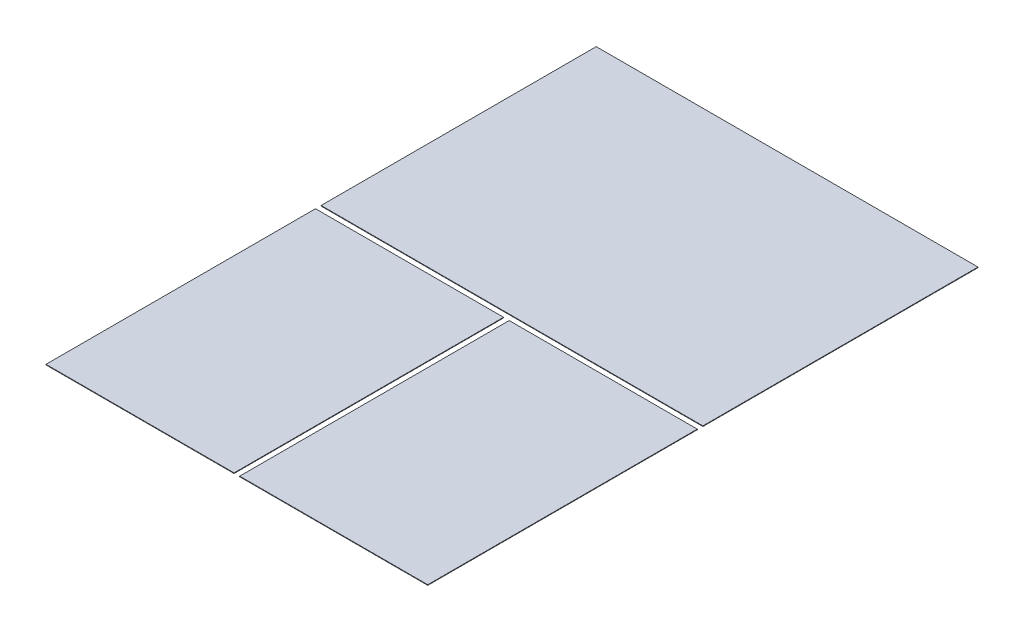
ISO-10303-21;
HEADER;
FILE_DESCRIPTION(('STEP AP214'),'2;1');
FILE_NAME('part.step','',(''),(''),'','','');
FILE_SCHEMA(('AUTOMOTIVE_DESIGN { 1 0 10303 214 1 1 1 1 }'));
ENDSEC;
DATA;
#1=APPLICATION_CONTEXT('core data for automotive mechanical design processes');
#2=APPLICATION_PROTOCOL_DEFINITION('international standard','automotive_design',2000,#1);
#3=PRODUCT_CONTEXT('',#1,'mechanical');
#4=PRODUCT('Part','Part','',(#3));
#5=PRODUCT_RELATED_PRODUCT_CATEGORY('part','',(#4));
#6=PRODUCT_DEFINITION_FORMATION('','',#4);
#7=PRODUCT_DEFINITION_CONTEXT('part definition',#1,'design');
#8=PRODUCT_DEFINITION('design','',#6,#7);
#9=PRODUCT_DEFINITION_SHAPE('','',#8);
#10=(LENGTH_UNIT() NAMED_UNIT(*) SI_UNIT(.MILLI.,.METRE.));
#11=(NAMED_UNIT(*) PLANE_ANGLE_UNIT() SI_UNIT($,.RADIAN.));
#12=(NAMED_UNIT(*) SI_UNIT($,.STERADIAN.) SOLID_ANGLE_UNIT());
#13=UNCERTAINTY_MEASURE_WITH_UNIT(LENGTH_MEASURE(1.E-05),#10,'distance_accuracy_value','');
#14=(GEOMETRIC_REPRESENTATION_CONTEXT(3) GLOBAL_UNCERTAINTY_ASSIGNED_CONTEXT((#13)) GLOBAL_UNIT_ASSIGNED_CONTEXT((#10,
#11,#12)) REPRESENTATION_CONTEXT('',''));
#15=CARTESIAN_POINT('',(0.,0.,0.));
#16=DIRECTION('',(0.,0.,1.));
#17=DIRECTION('',(1.,0.,0.));
#18=AXIS2_PLACEMENT_3D('',#15,#16,#17);
#19=CARTESIAN_POINT('',(122.303454746925,5.,0.));
#20=DIRECTION('',(1.,0.,0.));
#21=DIRECTION('',(0.,0.,-1.));
#22=AXIS2_PLACEMENT_3D('',#19,#20,#21);
#23=PLANE('',#22);
#24=DIRECTION('',(0.,0.,1.));
#25=VECTOR('',#24,1.);
#26=CARTESIAN_POINT('',(122.303454746925,0.,0.));
#27=LINE('',#26,#25);
#28=CARTESIAN_POINT('',(122.303454746925,0.,24.7790305469408));
#29=VERTEX_POINT('',#28);
#30=CARTESIAN_POINT('',(122.303454746925,0.,2424.77903054694));
#31=VERTEX_POINT('',#30);
#32=EDGE_CURVE('E109',#29,#31,#27,.T.);
#33=ORIENTED_EDGE('',*,*,#32,.F.);
#34=DIRECTION('',(0.,-1.,0.));
#35=VECTOR('',#34,1.);
#36=CARTESIAN_POINT('',(122.303454746925,5.,24.7790305469408));
#37=LINE('',#36,#35);
#38=CARTESIAN_POINT('',(122.303454746925,5.,24.7790305469408));
#39=VERTEX_POINT('',#38);
#40=EDGE_CURVE('E12',#39,#29,#37,.T.);
#41=ORIENTED_EDGE('',*,*,#40,.F.);
#42=DIRECTION('',(0.,0.,1.));
#43=VECTOR('',#42,1.);
#44=CARTESIAN_POINT('',(122.303454746925,5.,0.));
#45=LINE('',#44,#43);
#46=CARTESIAN_POINT('',(122.303454746925,5.,2424.77903054694));
#47=VERTEX_POINT('',#46);
#48=EDGE_CURVE('E103',#39,#47,#45,.T.);
#49=ORIENTED_EDGE('',*,*,#48,.T.);
#50=DIRECTION('',(0.,-1.,0.));
#51=VECTOR('',#50,1.);
#52=CARTESIAN_POINT('',(122.303454746925,5.,2424.77903054694));
#53=LINE('',#52,#51);
#54=EDGE_CURVE('E84',#47,#31,#53,.T.);
#55=ORIENTED_EDGE('',*,*,#54,.T.);
#56=EDGE_LOOP('',(#33,#41,#49,#55));
#57=FACE_BOUND('',#56,.T.);
#58=ADVANCED_FACE('F46',(#57),#23,.T.);
#59=CARTESIAN_POINT('',(0.,5.,24.7790305469408));
#60=DIRECTION('',(0.,0.,-1.));
#61=DIRECTION('',(-1.,0.,0.));
#62=AXIS2_PLACEMENT_3D('',#59,#60,#61);
#63=PLANE('',#62);
#64=DIRECTION('',(1.,0.,0.));
#65=VECTOR('',#64,1.);
#66=CARTESIAN_POINT('',(0.,0.,24.7790305469408));
#67=LINE('',#66,#65);
#68=CARTESIAN_POINT('',(-1552.69654525308,0.,24.7790305469408));
#69=VERTEX_POINT('',#68);
#70=EDGE_CURVE('E97',#69,#29,#67,.T.);
#71=ORIENTED_EDGE('',*,*,#70,.F.);
#72=DIRECTION('',(0.,-1.,0.));
#73=VECTOR('',#72,1.);
#74=CARTESIAN_POINT('',(-1552.69654525308,5.,24.7790305469408));
#75=LINE('',#74,#73);
#76=CARTESIAN_POINT('',(-1552.69654525308,5.,24.7790305469408));
#77=VERTEX_POINT('',#76);
#78=EDGE_CURVE('E54',#77,#69,#75,.T.);
#79=ORIENTED_EDGE('',*,*,#78,.F.);
#80=DIRECTION('',(1.,0.,0.));
#81=VECTOR('',#80,1.);
#82=CARTESIAN_POINT('',(0.,5.,24.7790305469408));
#83=LINE('',#82,#81);
#84=EDGE_CURVE('E95',#77,#39,#83,.T.);
#85=ORIENTED_EDGE('',*,*,#84,.T.);
#86=ORIENTED_EDGE('',*,*,#40,.T.);
#87=EDGE_LOOP('',(#71,#79,#85,#86));
#88=FACE_BOUND('',#87,.T.);
#89=ADVANCED_FACE('F93',(#88),#63,.T.);
#90=CARTESIAN_POINT('',(-1552.69654525308,5.,0.));
#91=DIRECTION('',(1.,0.,0.));
#92=DIRECTION('',(0.,0.,-1.));
#93=AXIS2_PLACEMENT_3D('',#90,#91,#92);
#94=PLANE('',#93);
#95=DIRECTION('',(0.,0.,1.));
#96=VECTOR('',#95,1.);
#97=CARTESIAN_POINT('',(-1552.69654525308,0.,0.));
#98=LINE('',#97,#96);
#99=CARTESIAN_POINT('',(-1552.69654525308,0.,2424.77903054694));
#100=VERTEX_POINT('',#99);
#101=EDGE_CURVE('E77',#69,#100,#98,.T.);
#102=ORIENTED_EDGE('',*,*,#101,.T.);
#103=DIRECTION('',(0.,-1.,0.));
#104=VECTOR('',#103,1.);
#105=CARTESIAN_POINT('',(-1552.69654525308,5.,2424.77903054694));
#106=LINE('',#105,#104);
#107=CARTESIAN_POINT('',(-1552.69654525308,5.,2424.77903054694));
#108=VERTEX_POINT('',#107);
#109=EDGE_CURVE('E98',#108,#100,#106,.T.);
#110=ORIENTED_EDGE('',*,*,#109,.F.);
#111=DIRECTION('',(0.,0.,1.));
#112=VECTOR('',#111,1.);
#113=CARTESIAN_POINT('',(-1552.69654525308,5.,0.));
#114=LINE('',#113,#112);
#115=EDGE_CURVE('E99',#77,#108,#114,.T.);
#116=ORIENTED_EDGE('',*,*,#115,.F.);
#117=ORIENTED_EDGE('',*,*,#78,.T.);
#118=EDGE_LOOP('',(#102,#110,#116,#117));
#119=FACE_BOUND('',#118,.T.);
#120=ADVANCED_FACE('F100',(#119),#94,.F.);
#121=CARTESIAN_POINT('',(-6.42876539544234E-13,5.,2424.77903054694));
#122=DIRECTION('',(0.,0.,-1.));
#123=DIRECTION('',(-1.,0.,0.));
#124=AXIS2_PLACEMENT_3D('',#121,#122,#123);
#125=PLANE('',#124);
#126=DIRECTION('',(1.,0.,0.));
#127=VECTOR('',#126,1.);
#128=CARTESIAN_POINT('',(-6.42876539544234E-13,0.,2424.77903054694));
#129=LINE('',#128,#127);
#130=EDGE_CURVE('E105',#100,#31,#129,.T.);
#131=ORIENTED_EDGE('',*,*,#130,.T.);
#132=ORIENTED_EDGE('',*,*,#54,.F.);
#133=DIRECTION('',(1.,0.,0.));
#134=VECTOR('',#133,1.);
#135=CARTESIAN_POINT('',(-6.42876539544234E-13,5.,2424.77903054694));
#136=LINE('',#135,#134);
#137=EDGE_CURVE('E62',#108,#47,#136,.T.);
#138=ORIENTED_EDGE('',*,*,#137,.F.);
#139=ORIENTED_EDGE('',*,*,#109,.T.);
#140=EDGE_LOOP('',(#131,#132,#138,#139));
#141=FACE_BOUND('',#140,.T.);
#142=ADVANCED_FACE('F118',(#141),#125,.F.);
#143=CARTESIAN_POINT('',(0.,5.,0.));
#144=DIRECTION('',(0.,1.,0.));
#145=DIRECTION('',(0.,0.,1.));
#146=AXIS2_PLACEMENT_3D('',#143,#144,#145);
#147=PLANE('',#146);
#148=ORIENTED_EDGE('',*,*,#48,.F.);
#149=ORIENTED_EDGE('',*,*,#84,.F.);
#150=ORIENTED_EDGE('',*,*,#115,.T.);
#151=ORIENTED_EDGE('',*,*,#137,.T.);
#152=EDGE_LOOP('',(#148,#149,#150,#151));
#153=FACE_BOUND('',#152,.T.);
#154=ADVANCED_FACE('F102',(#153),#147,.T.);
#155=CARTESIAN_POINT('',(0.,0.,0.));
#156=DIRECTION('',(0.,1.,0.));
#157=DIRECTION('',(0.,0.,1.));
#158=AXIS2_PLACEMENT_3D('',#155,#156,#157);
#159=PLANE('',#158);
#160=ORIENTED_EDGE('',*,*,#32,.T.);
#161=ORIENTED_EDGE('',*,*,#130,.F.);
#162=ORIENTED_EDGE('',*,*,#101,.F.);
#163=ORIENTED_EDGE('',*,*,#70,.T.);
#164=EDGE_LOOP('',(#160,#161,#162,#163));
#165=FACE_BOUND('',#164,.T.);
#166=ADVANCED_FACE('F120',(#165),#159,.F.);
#167=CLOSED_SHELL('',(#58,#89,#120,#142,#154,#166));
#168=MANIFOLD_SOLID_BREP('B2',#167);
#169=CARTESIAN_POINT('',(0.,5.,24.779030546941));
#170=DIRECTION('',(0.,0.,-1.));
#171=DIRECTION('',(-1.,0.,0.));
#172=AXIS2_PLACEMENT_3D('',#169,#170,#171);
#173=PLANE('',#172);
#174=DIRECTION('',(1.,0.,0.));
#175=VECTOR('',#174,1.);
#176=CARTESIAN_POINT('',(0.,0.,24.779030546941));
#177=LINE('',#176,#175);
#178=CARTESIAN_POINT('',(172.303454746924,0.,24.779030546941));
#179=VERTEX_POINT('',#178);
#180=CARTESIAN_POINT('',(1847.30345474692,0.,24.7790305469408));
#181=VERTEX_POINT('',#180);
#182=EDGE_CURVE('E245',#179,#181,#177,.T.);
#183=ORIENTED_EDGE('',*,*,#182,.F.);
#184=DIRECTION('',(0.,-1.,0.));
#185=VECTOR('',#184,1.);
#186=CARTESIAN_POINT('',(172.303454746924,5.,24.779030546941));
#187=LINE('',#186,#185);
#188=CARTESIAN_POINT('',(172.303454746924,5.,24.779030546941));
#189=VERTEX_POINT('',#188);
#190=EDGE_CURVE('E44',#189,#179,#187,.T.);
#191=ORIENTED_EDGE('',*,*,#190,.F.);
#192=DIRECTION('',(1.,0.,0.));
#193=VECTOR('',#192,1.);
#194=CARTESIAN_POINT('',(0.,5.,24.779030546941));
#195=LINE('',#194,#193);
#196=CARTESIAN_POINT('',(1847.30345474692,5.,24.7790305469408));
#197=VERTEX_POINT('',#196);
#198=EDGE_CURVE('E230',#189,#197,#195,.T.);
#199=ORIENTED_EDGE('',*,*,#198,.T.);
#200=DIRECTION('',(0.,-1.,0.));
#201=VECTOR('',#200,1.);
#202=CARTESIAN_POINT('',(1847.30345474692,5.,24.7790305469408));
#203=LINE('',#202,#201);
#204=EDGE_CURVE('E198',#197,#181,#203,.T.);
#205=ORIENTED_EDGE('',*,*,#204,.T.);
#206=EDGE_LOOP('',(#183,#191,#199,#205));
#207=FACE_BOUND('',#206,.T.);
#208=ADVANCED_FACE('F182',(#207),#173,.T.);
#209=CARTESIAN_POINT('',(172.303454746924,5.,0.));
#210=DIRECTION('',(1.,0.,0.));
#211=DIRECTION('',(0.,0.,-1.));
#212=AXIS2_PLACEMENT_3D('',#209,#210,#211);
#213=PLANE('',#212);
#214=DIRECTION('',(0.,0.,1.));
#215=VECTOR('',#214,1.);
#216=CARTESIAN_POINT('',(172.303454746924,0.,0.));
#217=LINE('',#216,#215);
#218=CARTESIAN_POINT('',(172.303454746925,0.,2424.77903054694));
#219=VERTEX_POINT('',#218);
#220=EDGE_CURVE('E236',#179,#219,#217,.T.);
#221=ORIENTED_EDGE('',*,*,#220,.T.);
#222=DIRECTION('',(0.,-1.,0.));
#223=VECTOR('',#222,1.);
#224=CARTESIAN_POINT('',(172.303454746925,5.,2424.77903054694));
#225=LINE('',#224,#223);
#226=CARTESIAN_POINT('',(172.303454746925,5.,2424.77903054694));
#227=VERTEX_POINT('',#226);
#228=EDGE_CURVE('E190',#227,#219,#225,.T.);
#229=ORIENTED_EDGE('',*,*,#228,.F.);
#230=DIRECTION('',(0.,0.,1.));
#231=VECTOR('',#230,1.);
#232=CARTESIAN_POINT('',(172.303454746924,5.,0.));
#233=LINE('',#232,#231);
#234=EDGE_CURVE('E224',#189,#227,#233,.T.);
#235=ORIENTED_EDGE('',*,*,#234,.F.);
#236=ORIENTED_EDGE('',*,*,#190,.T.);
#237=EDGE_LOOP('',(#221,#229,#235,#236));
#238=FACE_BOUND('',#237,.T.);
#239=ADVANCED_FACE('F234',(#238),#213,.F.);
#240=CARTESIAN_POINT('',(0.,5.,2424.77903054694));
#241=DIRECTION('',(0.,0.,1.));
#242=DIRECTION('',(1.,0.,0.));
#243=AXIS2_PLACEMENT_3D('',#240,#241,#242);
#244=PLANE('',#243);
#245=DIRECTION('',(-1.,0.,0.));
#246=VECTOR('',#245,1.);
#247=CARTESIAN_POINT('',(0.,0.,2424.77903054694));
#248=LINE('',#247,#246);
#249=CARTESIAN_POINT('',(1847.30345474692,0.,2424.77903054694));
#250=VERTEX_POINT('',#249);
#251=EDGE_CURVE('E248',#250,#219,#248,.T.);
#252=ORIENTED_EDGE('',*,*,#251,.F.);
#253=DIRECTION('',(0.,-1.,0.));
#254=VECTOR('',#253,1.);
#255=CARTESIAN_POINT('',(1847.30345474692,5.,2424.77903054694));
#256=LINE('',#255,#254);
#257=CARTESIAN_POINT('',(1847.30345474692,5.,2424.77903054694));
#258=VERTEX_POINT('',#257);
#259=EDGE_CURVE('E211',#258,#250,#256,.T.);
#260=ORIENTED_EDGE('',*,*,#259,.F.);
#261=DIRECTION('',(-1.,0.,0.));
#262=VECTOR('',#261,1.);
#263=CARTESIAN_POINT('',(0.,5.,2424.77903054694));
#264=LINE('',#263,#262);
#265=EDGE_CURVE('E229',#258,#227,#264,.T.);
#266=ORIENTED_EDGE('',*,*,#265,.T.);
#267=ORIENTED_EDGE('',*,*,#228,.T.);
#268=EDGE_LOOP('',(#252,#260,#266,#267));
#269=FACE_BOUND('',#268,.T.);
#270=ADVANCED_FACE('F239',(#269),#244,.T.);
#271=CARTESIAN_POINT('',(1847.30345474692,5.,-3.41819804821605E-13));
#272=DIRECTION('',(1.,0.,0.));
#273=DIRECTION('',(0.,0.,-1.));
#274=AXIS2_PLACEMENT_3D('',#271,#272,#273);
#275=PLANE('',#274);
#276=DIRECTION('',(0.,0.,1.));
#277=VECTOR('',#276,1.);
#278=CARTESIAN_POINT('',(1847.30345474692,0.,-3.41819804821605E-13));
#279=LINE('',#278,#277);
#280=EDGE_CURVE('E250',#181,#250,#279,.T.);
#281=ORIENTED_EDGE('',*,*,#280,.F.);
#282=ORIENTED_EDGE('',*,*,#204,.F.);
#283=DIRECTION('',(0.,0.,1.));
#284=VECTOR('',#283,1.);
#285=CARTESIAN_POINT('',(1847.30345474692,5.,-3.41819804821605E-13));
#286=LINE('',#285,#284);
#287=EDGE_CURVE('E240',#197,#258,#286,.T.);
#288=ORIENTED_EDGE('',*,*,#287,.T.);
#289=ORIENTED_EDGE('',*,*,#259,.T.);
#290=EDGE_LOOP('',(#281,#282,#288,#289));
#291=FACE_BOUND('',#290,.T.);
#292=ADVANCED_FACE('F255',(#291),#275,.T.);
#293=CARTESIAN_POINT('',(0.,5.,0.));
#294=DIRECTION('',(0.,1.,0.));
#295=DIRECTION('',(0.,0.,1.));
#296=AXIS2_PLACEMENT_3D('',#293,#294,#295);
#297=PLANE('',#296);
#298=ORIENTED_EDGE('',*,*,#198,.F.);
#299=ORIENTED_EDGE('',*,*,#234,.T.);
#300=ORIENTED_EDGE('',*,*,#265,.F.);
#301=ORIENTED_EDGE('',*,*,#287,.F.);
#302=EDGE_LOOP('',(#298,#299,#300,#301));
#303=FACE_BOUND('',#302,.T.);
#304=ADVANCED_FACE('F226',(#303),#297,.T.);
#305=CARTESIAN_POINT('',(0.,0.,0.));
#306=DIRECTION('',(0.,1.,0.));
#307=DIRECTION('',(0.,0.,1.));
#308=AXIS2_PLACEMENT_3D('',#305,#306,#307);
#309=PLANE('',#308);
#310=ORIENTED_EDGE('',*,*,#182,.T.);
#311=ORIENTED_EDGE('',*,*,#280,.T.);
#312=ORIENTED_EDGE('',*,*,#251,.T.);
#313=ORIENTED_EDGE('',*,*,#220,.F.);
#314=EDGE_LOOP('',(#310,#311,#312,#313));
#315=FACE_BOUND('',#314,.T.);
#316=ADVANCED_FACE('F262',(#315),#309,.F.);
#317=CLOSED_SHELL('',(#208,#239,#270,#292,#304,#316));
#318=MANIFOLD_SOLID_BREP('B6',#317);
#319=CARTESIAN_POINT('',(-1552.69654525308,5.,0.));
#320=DIRECTION('',(-1.,0.,0.));
#321=DIRECTION('',(0.,0.,1.));
#322=AXIS2_PLACEMENT_3D('',#319,#320,#321);
#323=PLANE('',#322);
#324=DIRECTION('',(0.,0.,-1.));
#325=VECTOR('',#324,1.);
#326=CARTESIAN_POINT('',(-1552.69654525308,0.,0.));
#327=LINE('',#326,#325);
#328=CARTESIAN_POINT('',(-1552.69654525308,0.,-25.2209694530592));
#329=VERTEX_POINT('',#328);
#330=CARTESIAN_POINT('',(-1552.69654525308,0.,-2475.22096945306));
#331=VERTEX_POINT('',#330);
#332=EDGE_CURVE('E372',#329,#331,#327,.T.);
#333=ORIENTED_EDGE('',*,*,#332,.F.);
#334=DIRECTION('',(0.,-1.,0.));
#335=VECTOR('',#334,1.);
#336=CARTESIAN_POINT('',(-1552.69654525308,5.,-25.2209694530592));
#337=LINE('',#336,#335);
#338=CARTESIAN_POINT('',(-1552.69654525308,5.,-25.2209694530592));
#339=VERTEX_POINT('',#338);
#340=EDGE_CURVE('E180',#339,#329,#337,.T.);
#341=ORIENTED_EDGE('',*,*,#340,.F.);
#342=DIRECTION('',(0.,0.,-1.));
#343=VECTOR('',#342,1.);
#344=CARTESIAN_POINT('',(-1552.69654525308,5.,0.));
#345=LINE('',#344,#343);
#346=CARTESIAN_POINT('',(-1552.69654525308,5.,-2475.22096945306));
#347=VERTEX_POINT('',#346);
#348=EDGE_CURVE('E366',#339,#347,#345,.T.);
#349=ORIENTED_EDGE('',*,*,#348,.T.);
#350=DIRECTION('',(0.,-1.,0.));
#351=VECTOR('',#350,1.);
#352=CARTESIAN_POINT('',(-1552.69654525308,5.,-2475.22096945306));
#353=LINE('',#352,#351);
#354=EDGE_CURVE('E347',#347,#331,#353,.T.);
#355=ORIENTED_EDGE('',*,*,#354,.T.);
#356=EDGE_LOOP('',(#333,#341,#349,#355));
#357=FACE_BOUND('',#356,.T.);
#358=ADVANCED_FACE('F309',(#357),#323,.T.);
#359=CARTESIAN_POINT('',(0.,5.,-25.2209694530592));
#360=DIRECTION('',(0.,0.,1.));
#361=DIRECTION('',(1.,0.,0.));
#362=AXIS2_PLACEMENT_3D('',#359,#360,#361);
#363=PLANE('',#362);
#364=DIRECTION('',(-1.,0.,0.));
#365=VECTOR('',#364,1.);
#366=CARTESIAN_POINT('',(0.,0.,-25.2209694530592));
#367=LINE('',#366,#365);
#368=CARTESIAN_POINT('',(1847.30345474692,0.,-25.2209694530592));
#369=VERTEX_POINT('',#368);
#370=EDGE_CURVE('E360',#369,#329,#367,.T.);
#371=ORIENTED_EDGE('',*,*,#370,.F.);
#372=DIRECTION('',(0.,-1.,0.));
#373=VECTOR('',#372,1.);
#374=CARTESIAN_POINT('',(1847.30345474692,5.,-25.2209694530592));
#375=LINE('',#374,#373);
#376=CARTESIAN_POINT('',(1847.30345474692,5.,-25.2209694530592));
#377=VERTEX_POINT('',#376);
#378=EDGE_CURVE('E317',#377,#369,#375,.T.);
#379=ORIENTED_EDGE('',*,*,#378,.F.);
#380=DIRECTION('',(-1.,0.,0.));
#381=VECTOR('',#380,1.);
#382=CARTESIAN_POINT('',(0.,5.,-25.2209694530592));
#383=LINE('',#382,#381);
#384=EDGE_CURVE('E358',#377,#339,#383,.T.);
#385=ORIENTED_EDGE('',*,*,#384,.T.);
#386=ORIENTED_EDGE('',*,*,#340,.T.);
#387=EDGE_LOOP('',(#371,#379,#385,#386));
#388=FACE_BOUND('',#387,.T.);
#389=ADVANCED_FACE('F356',(#388),#363,.T.);
#390=CARTESIAN_POINT('',(1847.30345474692,5.,0.));
#391=DIRECTION('',(-1.,0.,0.));
#392=DIRECTION('',(0.,0.,1.));
#393=AXIS2_PLACEMENT_3D('',#390,#391,#392);
#394=PLANE('',#393);
#395=DIRECTION('',(0.,0.,-1.));
#396=VECTOR('',#395,1.);
#397=CARTESIAN_POINT('',(1847.30345474692,0.,0.));
#398=LINE('',#397,#396);
#399=CARTESIAN_POINT('',(1847.30345474692,0.,-2475.22096945306));
#400=VERTEX_POINT('',#399);
#401=EDGE_CURVE('E340',#369,#400,#398,.T.);
#402=ORIENTED_EDGE('',*,*,#401,.T.);
#403=DIRECTION('',(0.,-1.,0.));
#404=VECTOR('',#403,1.);
#405=CARTESIAN_POINT('',(1847.30345474692,5.,-2475.22096945306));
#406=LINE('',#405,#404);
#407=CARTESIAN_POINT('',(1847.30345474692,5.,-2475.22096945306));
#408=VERTEX_POINT('',#407);
#409=EDGE_CURVE('E361',#408,#400,#406,.T.);
#410=ORIENTED_EDGE('',*,*,#409,.F.);
#411=DIRECTION('',(0.,0.,-1.));
#412=VECTOR('',#411,1.);
#413=CARTESIAN_POINT('',(1847.30345474692,5.,0.));
#414=LINE('',#413,#412);
#415=EDGE_CURVE('E362',#377,#408,#414,.T.);
#416=ORIENTED_EDGE('',*,*,#415,.F.);
#417=ORIENTED_EDGE('',*,*,#378,.T.);
#418=EDGE_LOOP('',(#402,#410,#416,#417));
#419=FACE_BOUND('',#418,.T.);
#420=ADVANCED_FACE('F363',(#419),#394,.F.);
#421=CARTESIAN_POINT('',(3.23299683684916E-13,5.,-2475.22096945306));
#422=DIRECTION('',(0.,0.,1.));
#423=DIRECTION('',(1.,0.,0.));
#424=AXIS2_PLACEMENT_3D('',#421,#422,#423);
#425=PLANE('',#424);
#426=DIRECTION('',(-1.,0.,0.));
#427=VECTOR('',#426,1.);
#428=CARTESIAN_POINT('',(3.23299683684916E-13,0.,-2475.22096945306));
#429=LINE('',#428,#427);
#430=EDGE_CURVE('E368',#400,#331,#429,.T.);
#431=ORIENTED_EDGE('',*,*,#430,.T.);
#432=ORIENTED_EDGE('',*,*,#354,.F.);
#433=DIRECTION('',(-1.,0.,0.));
#434=VECTOR('',#433,1.);
#435=CARTESIAN_POINT('',(3.23299683684916E-13,5.,-2475.22096945306));
#436=LINE('',#435,#434);
#437=EDGE_CURVE('E325',#408,#347,#436,.T.);
#438=ORIENTED_EDGE('',*,*,#437,.F.);
#439=ORIENTED_EDGE('',*,*,#409,.T.);
#440=EDGE_LOOP('',(#431,#432,#438,#439));
#441=FACE_BOUND('',#440,.T.);
#442=ADVANCED_FACE('F381',(#441),#425,.F.);
#443=CARTESIAN_POINT('',(0.,5.,0.));
#444=DIRECTION('',(0.,1.,0.));
#445=DIRECTION('',(0.,0.,1.));
#446=AXIS2_PLACEMENT_3D('',#443,#444,#445);
#447=PLANE('',#446);
#448=ORIENTED_EDGE('',*,*,#348,.F.);
#449=ORIENTED_EDGE('',*,*,#384,.F.);
#450=ORIENTED_EDGE('',*,*,#415,.T.);
#451=ORIENTED_EDGE('',*,*,#437,.T.);
#452=EDGE_LOOP('',(#448,#449,#450,#451));
#453=FACE_BOUND('',#452,.T.);
#454=ADVANCED_FACE('F365',(#453),#447,.T.);
#455=CARTESIAN_POINT('',(0.,0.,0.));
#456=DIRECTION('',(0.,1.,0.));
#457=DIRECTION('',(0.,0.,1.));
#458=AXIS2_PLACEMENT_3D('',#455,#456,#457);
#459=PLANE('',#458);
#460=ORIENTED_EDGE('',*,*,#332,.T.);
#461=ORIENTED_EDGE('',*,*,#430,.F.);
#462=ORIENTED_EDGE('',*,*,#401,.F.);
#463=ORIENTED_EDGE('',*,*,#370,.T.);
#464=EDGE_LOOP('',(#460,#461,#462,#463));
#465=FACE_BOUND('',#464,.T.);
#466=ADVANCED_FACE('F383',(#465),#459,.F.);
#467=CLOSED_SHELL('',(#358,#389,#420,#442,#454,#466));
#468=MANIFOLD_SOLID_BREP('B38',#467);
#469=ADVANCED_BREP_SHAPE_REPRESENTATION('',(#18,#168,#318,#468),#14);
#470=SHAPE_DEFINITION_REPRESENTATION(#9,#469);
ENDSEC;
END-ISO-10303-21;
